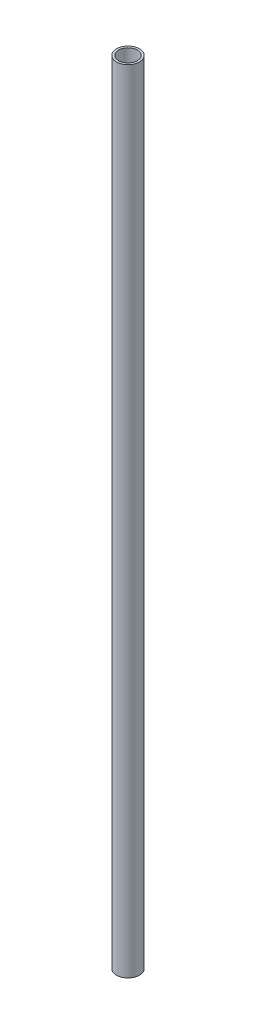
ISO-10303-21;
HEADER;
FILE_DESCRIPTION(('STEP AP214'),'2;1');
FILE_NAME('part.step','',(''),(''),'','','');
FILE_SCHEMA(('AUTOMOTIVE_DESIGN { 1 0 10303 214 1 1 1 1 }'));
ENDSEC;
DATA;
#1=APPLICATION_CONTEXT('core data for automotive mechanical design processes');
#2=APPLICATION_PROTOCOL_DEFINITION('international standard','automotive_design',2000,#1);
#3=PRODUCT_CONTEXT('',#1,'mechanical');
#4=PRODUCT('Part','Part','',(#3));
#5=PRODUCT_RELATED_PRODUCT_CATEGORY('part','',(#4));
#6=PRODUCT_DEFINITION_FORMATION('','',#4);
#7=PRODUCT_DEFINITION_CONTEXT('part definition',#1,'design');
#8=PRODUCT_DEFINITION('design','',#6,#7);
#9=PRODUCT_DEFINITION_SHAPE('','',#8);
#10=(LENGTH_UNIT() NAMED_UNIT(*) SI_UNIT(.MILLI.,.METRE.));
#11=(NAMED_UNIT(*) PLANE_ANGLE_UNIT() SI_UNIT($,.RADIAN.));
#12=(NAMED_UNIT(*) SI_UNIT($,.STERADIAN.) SOLID_ANGLE_UNIT());
#13=UNCERTAINTY_MEASURE_WITH_UNIT(LENGTH_MEASURE(1.E-05),#10,'distance_accuracy_value','');
#14=(GEOMETRIC_REPRESENTATION_CONTEXT(3) GLOBAL_UNCERTAINTY_ASSIGNED_CONTEXT((#13)) GLOBAL_UNIT_ASSIGNED_CONTEXT((#10,
#11,#12)) REPRESENTATION_CONTEXT('',''));
#15=CARTESIAN_POINT('',(0.,0.,0.));
#16=DIRECTION('',(0.,0.,1.));
#17=DIRECTION('',(1.,0.,0.));
#18=AXIS2_PLACEMENT_3D('',#15,#16,#17);
#19=CARTESIAN_POINT('',(0.,333.,0.));
#20=DIRECTION('',(0.,1.,0.));
#21=DIRECTION('',(0.,0.,1.));
#22=AXIS2_PLACEMENT_3D('',#19,#20,#21);
#23=PLANE('',#22);
#24=CARTESIAN_POINT('',(0.,333.,0.));
#25=DIRECTION('',(0.,1.,0.));
#26=DIRECTION('',(0.,0.,1.));
#27=AXIS2_PLACEMENT_3D('',#24,#25,#26);
#28=CIRCLE('',#27,4.825);
#29=CARTESIAN_POINT('',(0.,333.,4.825));
#30=VERTEX_POINT('',#29);
#31=EDGE_CURVE('E10',#30,#30,#28,.T.);
#32=ORIENTED_EDGE('',*,*,#31,.T.);
#33=EDGE_LOOP('',(#32));
#34=FACE_BOUND('',#33,.T.);
#35=CARTESIAN_POINT('',(0.,333.,0.));
#36=DIRECTION('',(0.,1.,0.));
#37=DIRECTION('',(0.,0.,1.));
#38=AXIS2_PLACEMENT_3D('',#35,#36,#37);
#39=CIRCLE('',#38,3.925);
#40=CARTESIAN_POINT('',(0.,333.,3.925));
#41=VERTEX_POINT('',#40);
#42=EDGE_CURVE('E52',#41,#41,#39,.T.);
#43=ORIENTED_EDGE('',*,*,#42,.F.);
#44=EDGE_LOOP('',(#43));
#45=FACE_BOUND('',#44,.T.);
#46=ADVANCED_FACE('F41',(#34,#45),#23,.T.);
#47=CARTESIAN_POINT('',(0.,0.,0.));
#48=DIRECTION('',(0.,1.,0.));
#49=DIRECTION('',(0.,0.,1.));
#50=AXIS2_PLACEMENT_3D('',#47,#48,#49);
#51=PLANE('',#50);
#52=CARTESIAN_POINT('',(0.,0.,0.));
#53=DIRECTION('',(0.,1.,0.));
#54=DIRECTION('',(0.,0.,1.));
#55=AXIS2_PLACEMENT_3D('',#52,#53,#54);
#56=CIRCLE('',#55,4.825);
#57=CARTESIAN_POINT('',(0.,0.,4.825));
#58=VERTEX_POINT('',#57);
#59=EDGE_CURVE('E45',#58,#58,#56,.T.);
#60=ORIENTED_EDGE('',*,*,#59,.F.);
#61=EDGE_LOOP('',(#60));
#62=FACE_BOUND('',#61,.T.);
#63=CARTESIAN_POINT('',(0.,0.,0.));
#64=DIRECTION('',(0.,1.,0.));
#65=DIRECTION('',(0.,0.,1.));
#66=AXIS2_PLACEMENT_3D('',#63,#64,#65);
#67=CIRCLE('',#66,3.925);
#68=CARTESIAN_POINT('',(0.,0.,3.925));
#69=VERTEX_POINT('',#68);
#70=EDGE_CURVE('E54',#69,#69,#67,.T.);
#71=ORIENTED_EDGE('',*,*,#70,.T.);
#72=EDGE_LOOP('',(#71));
#73=FACE_BOUND('',#72,.T.);
#74=ADVANCED_FACE('F64',(#62,#73),#51,.F.);
#75=CARTESIAN_POINT('',(0.,333.,0.));
#76=DIRECTION('',(0.,-1.,0.));
#77=DIRECTION('',(0.,0.,-1.));
#78=AXIS2_PLACEMENT_3D('',#75,#76,#77);
#79=CYLINDRICAL_SURFACE('',#78,4.825);
#80=ORIENTED_EDGE('',*,*,#31,.F.);
#81=EDGE_LOOP('',(#80));
#82=FACE_BOUND('',#81,.T.);
#83=ORIENTED_EDGE('',*,*,#59,.T.);
#84=EDGE_LOOP('',(#83));
#85=FACE_BOUND('',#84,.T.);
#86=ADVANCED_FACE('F43',(#82,#85),#79,.T.);
#87=CARTESIAN_POINT('',(0.,333.,0.));
#88=DIRECTION('',(0.,-1.,0.));
#89=DIRECTION('',(0.,0.,-1.));
#90=AXIS2_PLACEMENT_3D('',#87,#88,#89);
#91=CYLINDRICAL_SURFACE('',#90,3.925);
#92=ORIENTED_EDGE('',*,*,#42,.T.);
#93=EDGE_LOOP('',(#92));
#94=FACE_BOUND('',#93,.T.);
#95=ORIENTED_EDGE('',*,*,#70,.F.);
#96=EDGE_LOOP('',(#95));
#97=FACE_BOUND('',#96,.T.);
#98=ADVANCED_FACE('F60',(#94,#97),#91,.F.);
#99=CLOSED_SHELL('',(#46,#74,#86,#98));
#100=MANIFOLD_SOLID_BREP('B2',#99);
#101=ADVANCED_BREP_SHAPE_REPRESENTATION('',(#18,#100),#14);
#102=SHAPE_DEFINITION_REPRESENTATION(#9,#101);
ENDSEC;
END-ISO-10303-21;
